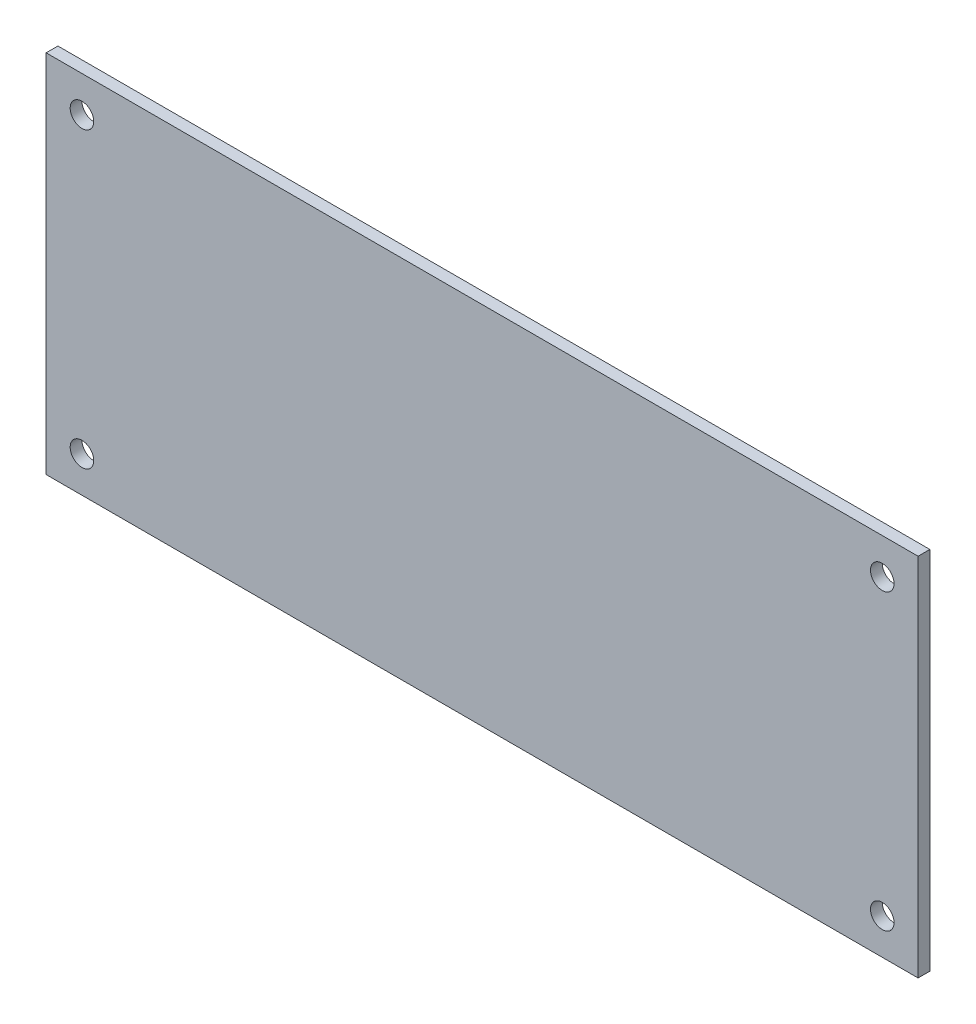
ISO-10303-21;
HEADER;
FILE_DESCRIPTION(('STEP AP214'),'2;1');
FILE_NAME('part.step','',(''),(''),'','','');
FILE_SCHEMA(('AUTOMOTIVE_DESIGN { 1 0 10303 214 1 1 1 1 }'));
ENDSEC;
DATA;
#1=APPLICATION_CONTEXT('core data for automotive mechanical design processes');
#2=APPLICATION_PROTOCOL_DEFINITION('international standard','automotive_design',2000,#1);
#3=PRODUCT_CONTEXT('',#1,'mechanical');
#4=PRODUCT('Part','Part','',(#3));
#5=PRODUCT_RELATED_PRODUCT_CATEGORY('part','',(#4));
#6=PRODUCT_DEFINITION_FORMATION('','',#4);
#7=PRODUCT_DEFINITION_CONTEXT('part definition',#1,'design');
#8=PRODUCT_DEFINITION('design','',#6,#7);
#9=PRODUCT_DEFINITION_SHAPE('','',#8);
#10=(LENGTH_UNIT() NAMED_UNIT(*) SI_UNIT(.MILLI.,.METRE.));
#11=(NAMED_UNIT(*) PLANE_ANGLE_UNIT() SI_UNIT($,.RADIAN.));
#12=(NAMED_UNIT(*) SI_UNIT($,.STERADIAN.) SOLID_ANGLE_UNIT());
#13=UNCERTAINTY_MEASURE_WITH_UNIT(LENGTH_MEASURE(1.E-05),#10,'distance_accuracy_value','');
#14=(GEOMETRIC_REPRESENTATION_CONTEXT(3) GLOBAL_UNCERTAINTY_ASSIGNED_CONTEXT((#13)) GLOBAL_UNIT_ASSIGNED_CONTEXT((#10,
#11,#12)) REPRESENTATION_CONTEXT('',''));
#15=CARTESIAN_POINT('',(0.,0.,0.));
#16=DIRECTION('',(0.,0.,1.));
#17=DIRECTION('',(1.,0.,0.));
#18=AXIS2_PLACEMENT_3D('',#15,#16,#17);
#19=CARTESIAN_POINT('',(117.475,-49.2125,3.175));
#20=DIRECTION('',(-1.,0.,0.));
#21=DIRECTION('',(0.,0.,1.));
#22=AXIS2_PLACEMENT_3D('',#19,#20,#21);
#23=PLANE('',#22);
#24=DIRECTION('',(0.,1.,0.));
#25=VECTOR('',#24,1.);
#26=CARTESIAN_POINT('',(117.475,-49.2125,0.));
#27=LINE('',#26,#25);
#28=CARTESIAN_POINT('',(117.475,-49.2125,0.));
#29=VERTEX_POINT('',#28);
#30=CARTESIAN_POINT('',(117.475,49.2125,0.));
#31=VERTEX_POINT('',#30);
#32=EDGE_CURVE('E96',#29,#31,#27,.T.);
#33=ORIENTED_EDGE('',*,*,#32,.T.);
#34=DIRECTION('',(0.,0.,-1.));
#35=VECTOR('',#34,1.);
#36=CARTESIAN_POINT('',(117.475,49.2125,3.175));
#37=LINE('',#36,#35);
#38=CARTESIAN_POINT('',(117.475,49.2125,3.175));
#39=VERTEX_POINT('',#38);
#40=EDGE_CURVE('E11',#39,#31,#37,.T.);
#41=ORIENTED_EDGE('',*,*,#40,.F.);
#42=DIRECTION('',(0.,1.,0.));
#43=VECTOR('',#42,1.);
#44=CARTESIAN_POINT('',(117.475,-49.2125,3.175));
#45=LINE('',#44,#43);
#46=CARTESIAN_POINT('',(117.475,-49.2125,3.175));
#47=VERTEX_POINT('',#46);
#48=EDGE_CURVE('E84',#47,#39,#45,.T.);
#49=ORIENTED_EDGE('',*,*,#48,.F.);
#50=DIRECTION('',(0.,0.,-1.));
#51=VECTOR('',#50,1.);
#52=CARTESIAN_POINT('',(117.475,-49.2125,3.175));
#53=LINE('',#52,#51);
#54=EDGE_CURVE('E92',#47,#29,#53,.T.);
#55=ORIENTED_EDGE('',*,*,#54,.T.);
#56=EDGE_LOOP('',(#33,#41,#49,#55));
#57=FACE_BOUND('',#56,.T.);
#58=ADVANCED_FACE('F33',(#57),#23,.F.);
#59=CARTESIAN_POINT('',(-117.475,49.2125,3.175));
#60=DIRECTION('',(0.,-1.,0.));
#61=DIRECTION('',(1.,0.,0.));
#62=AXIS2_PLACEMENT_3D('',#59,#60,#61);
#63=PLANE('',#62);
#64=DIRECTION('',(-1.,0.,0.));
#65=VECTOR('',#64,1.);
#66=CARTESIAN_POINT('',(-117.475,49.2125,0.));
#67=LINE('',#66,#65);
#68=CARTESIAN_POINT('',(-117.475,49.2125,0.));
#69=VERTEX_POINT('',#68);
#70=EDGE_CURVE('E88',#31,#69,#67,.T.);
#71=ORIENTED_EDGE('',*,*,#70,.T.);
#72=DIRECTION('',(0.,0.,-1.));
#73=VECTOR('',#72,1.);
#74=CARTESIAN_POINT('',(-117.475,49.2125,3.175));
#75=LINE('',#74,#73);
#76=CARTESIAN_POINT('',(-117.475,49.2125,3.175));
#77=VERTEX_POINT('',#76);
#78=EDGE_CURVE('E41',#77,#69,#75,.T.);
#79=ORIENTED_EDGE('',*,*,#78,.F.);
#80=DIRECTION('',(-1.,0.,0.));
#81=VECTOR('',#80,1.);
#82=CARTESIAN_POINT('',(-117.475,49.2125,3.175));
#83=LINE('',#82,#81);
#84=EDGE_CURVE('E79',#39,#77,#83,.T.);
#85=ORIENTED_EDGE('',*,*,#84,.F.);
#86=ORIENTED_EDGE('',*,*,#40,.T.);
#87=EDGE_LOOP('',(#71,#79,#85,#86));
#88=FACE_BOUND('',#87,.T.);
#89=ADVANCED_FACE('F87',(#88),#63,.F.);
#90=CARTESIAN_POINT('',(-117.475,-49.2125,3.175));
#91=DIRECTION('',(1.,0.,0.));
#92=DIRECTION('',(0.,0.,-1.));
#93=AXIS2_PLACEMENT_3D('',#90,#91,#92);
#94=PLANE('',#93);
#95=DIRECTION('',(0.,-1.,0.));
#96=VECTOR('',#95,1.);
#97=CARTESIAN_POINT('',(-117.475,-49.2125,0.));
#98=LINE('',#97,#96);
#99=CARTESIAN_POINT('',(-117.475,-49.2125,0.));
#100=VERTEX_POINT('',#99);
#101=EDGE_CURVE('E66',#69,#100,#98,.T.);
#102=ORIENTED_EDGE('',*,*,#101,.T.);
#103=DIRECTION('',(0.,0.,-1.));
#104=VECTOR('',#103,1.);
#105=CARTESIAN_POINT('',(-117.475,-49.2125,3.175));
#106=LINE('',#105,#104);
#107=CARTESIAN_POINT('',(-117.475,-49.2125,3.175));
#108=VERTEX_POINT('',#107);
#109=EDGE_CURVE('E89',#108,#100,#106,.T.);
#110=ORIENTED_EDGE('',*,*,#109,.F.);
#111=DIRECTION('',(0.,-1.,0.));
#112=VECTOR('',#111,1.);
#113=CARTESIAN_POINT('',(-117.475,-49.2125,3.175));
#114=LINE('',#113,#112);
#115=EDGE_CURVE('E82',#77,#108,#114,.T.);
#116=ORIENTED_EDGE('',*,*,#115,.F.);
#117=ORIENTED_EDGE('',*,*,#78,.T.);
#118=EDGE_LOOP('',(#102,#110,#116,#117));
#119=FACE_BOUND('',#118,.T.);
#120=ADVANCED_FACE('F90',(#119),#94,.F.);
#121=CARTESIAN_POINT('',(-117.475,-49.2125,3.175));
#122=DIRECTION('',(0.,1.,0.));
#123=DIRECTION('',(-1.,0.,0.));
#124=AXIS2_PLACEMENT_3D('',#121,#122,#123);
#125=PLANE('',#124);
#126=DIRECTION('',(1.,0.,0.));
#127=VECTOR('',#126,1.);
#128=CARTESIAN_POINT('',(-117.475,-49.2125,0.));
#129=LINE('',#128,#127);
#130=EDGE_CURVE('E72',#100,#29,#129,.T.);
#131=ORIENTED_EDGE('',*,*,#130,.T.);
#132=ORIENTED_EDGE('',*,*,#54,.F.);
#133=DIRECTION('',(1.,0.,0.));
#134=VECTOR('',#133,1.);
#135=CARTESIAN_POINT('',(-117.475,-49.2125,3.175));
#136=LINE('',#135,#134);
#137=EDGE_CURVE('E49',#108,#47,#136,.T.);
#138=ORIENTED_EDGE('',*,*,#137,.F.);
#139=ORIENTED_EDGE('',*,*,#109,.T.);
#140=EDGE_LOOP('',(#131,#132,#138,#139));
#141=FACE_BOUND('',#140,.T.);
#142=ADVANCED_FACE('F104',(#141),#125,.F.);
#143=CARTESIAN_POINT('',(0.,0.,3.175));
#144=DIRECTION('',(0.,0.,-1.));
#145=DIRECTION('',(-1.,0.,0.));
#146=AXIS2_PLACEMENT_3D('',#143,#144,#145);
#147=PLANE('',#146);
#148=CARTESIAN_POINT('',(-107.823,-39.5605,3.175));
#149=DIRECTION('',(0.,0.,1.));
#150=DIRECTION('',(1.,0.,0.));
#151=AXIS2_PLACEMENT_3D('',#148,#149,#150);
#152=CIRCLE('',#151,3.175);
#153=CARTESIAN_POINT('',(-104.648,-39.5605,3.175));
#154=VERTEX_POINT('',#153);
#155=EDGE_CURVE('E128',#154,#154,#152,.T.);
#156=ORIENTED_EDGE('',*,*,#155,.F.);
#157=EDGE_LOOP('',(#156));
#158=FACE_BOUND('',#157,.T.);
#159=CARTESIAN_POINT('',(107.823,39.5605,3.175));
#160=DIRECTION('',(0.,0.,1.));
#161=DIRECTION('',(1.,0.,0.));
#162=AXIS2_PLACEMENT_3D('',#159,#160,#161);
#163=CIRCLE('',#162,3.175);
#164=CARTESIAN_POINT('',(110.998,39.5605,3.175));
#165=VERTEX_POINT('',#164);
#166=EDGE_CURVE('E122',#165,#165,#163,.T.);
#167=ORIENTED_EDGE('',*,*,#166,.F.);
#168=EDGE_LOOP('',(#167));
#169=FACE_BOUND('',#168,.T.);
#170=CARTESIAN_POINT('',(107.823,-39.5605,3.175));
#171=DIRECTION('',(0.,0.,1.));
#172=DIRECTION('',(1.,0.,0.));
#173=AXIS2_PLACEMENT_3D('',#170,#171,#172);
#174=CIRCLE('',#173,3.175);
#175=CARTESIAN_POINT('',(110.998,-39.5605,3.175));
#176=VERTEX_POINT('',#175);
#177=EDGE_CURVE('E116',#176,#176,#174,.T.);
#178=ORIENTED_EDGE('',*,*,#177,.F.);
#179=EDGE_LOOP('',(#178));
#180=FACE_BOUND('',#179,.T.);
#181=CARTESIAN_POINT('',(-107.823,39.5605,3.175));
#182=DIRECTION('',(0.,0.,1.));
#183=DIRECTION('',(1.,0.,0.));
#184=AXIS2_PLACEMENT_3D('',#181,#182,#183);
#185=CIRCLE('',#184,3.175);
#186=CARTESIAN_POINT('',(-104.648,39.5605,3.175));
#187=VERTEX_POINT('',#186);
#188=EDGE_CURVE('E110',#187,#187,#185,.T.);
#189=ORIENTED_EDGE('',*,*,#188,.F.);
#190=EDGE_LOOP('',(#189));
#191=FACE_BOUND('',#190,.T.);
#192=ORIENTED_EDGE('',*,*,#48,.T.);
#193=ORIENTED_EDGE('',*,*,#84,.T.);
#194=ORIENTED_EDGE('',*,*,#115,.T.);
#195=ORIENTED_EDGE('',*,*,#137,.T.);
#196=EDGE_LOOP('',(#192,#193,#194,#195));
#197=FACE_BOUND('',#196,.T.);
#198=ADVANCED_FACE('F80',(#158,#169,#180,#191,#197),#147,.F.);
#199=CARTESIAN_POINT('',(0.,0.,0.));
#200=DIRECTION('',(0.,0.,-1.));
#201=DIRECTION('',(-1.,0.,0.));
#202=AXIS2_PLACEMENT_3D('',#199,#200,#201);
#203=PLANE('',#202);
#204=CARTESIAN_POINT('',(-107.823,-39.5605,0.));
#205=DIRECTION('',(0.,0.,1.));
#206=DIRECTION('',(1.,0.,0.));
#207=AXIS2_PLACEMENT_3D('',#204,#205,#206);
#208=CIRCLE('',#207,3.175);
#209=CARTESIAN_POINT('',(-104.648,-39.5605,0.));
#210=VERTEX_POINT('',#209);
#211=EDGE_CURVE('E113',#210,#210,#208,.T.);
#212=ORIENTED_EDGE('',*,*,#211,.T.);
#213=EDGE_LOOP('',(#212));
#214=FACE_BOUND('',#213,.T.);
#215=CARTESIAN_POINT('',(107.823,39.5605,0.));
#216=DIRECTION('',(0.,0.,1.));
#217=DIRECTION('',(1.,0.,0.));
#218=AXIS2_PLACEMENT_3D('',#215,#216,#217);
#219=CIRCLE('',#218,3.175);
#220=CARTESIAN_POINT('',(110.998,39.5605,0.));
#221=VERTEX_POINT('',#220);
#222=EDGE_CURVE('E125',#221,#221,#219,.T.);
#223=ORIENTED_EDGE('',*,*,#222,.T.);
#224=EDGE_LOOP('',(#223));
#225=FACE_BOUND('',#224,.T.);
#226=CARTESIAN_POINT('',(107.823,-39.5605,0.));
#227=DIRECTION('',(0.,0.,1.));
#228=DIRECTION('',(1.,0.,0.));
#229=AXIS2_PLACEMENT_3D('',#226,#227,#228);
#230=CIRCLE('',#229,3.175);
#231=CARTESIAN_POINT('',(110.998,-39.5605,0.));
#232=VERTEX_POINT('',#231);
#233=EDGE_CURVE('E119',#232,#232,#230,.T.);
#234=ORIENTED_EDGE('',*,*,#233,.T.);
#235=EDGE_LOOP('',(#234));
#236=FACE_BOUND('',#235,.T.);
#237=CARTESIAN_POINT('',(-107.823,39.5605,0.));
#238=DIRECTION('',(0.,0.,1.));
#239=DIRECTION('',(1.,0.,0.));
#240=AXIS2_PLACEMENT_3D('',#237,#238,#239);
#241=CIRCLE('',#240,3.175);
#242=CARTESIAN_POINT('',(-104.648,39.5605,0.));
#243=VERTEX_POINT('',#242);
#244=EDGE_CURVE('E99',#243,#243,#241,.T.);
#245=ORIENTED_EDGE('',*,*,#244,.T.);
#246=EDGE_LOOP('',(#245));
#247=FACE_BOUND('',#246,.T.);
#248=ORIENTED_EDGE('',*,*,#32,.F.);
#249=ORIENTED_EDGE('',*,*,#130,.F.);
#250=ORIENTED_EDGE('',*,*,#101,.F.);
#251=ORIENTED_EDGE('',*,*,#70,.F.);
#252=EDGE_LOOP('',(#248,#249,#250,#251));
#253=FACE_BOUND('',#252,.T.);
#254=ADVANCED_FACE('F107',(#214,#225,#236,#247,#253),#203,.T.);
#255=CARTESIAN_POINT('',(-107.823,39.5605,0.));
#256=DIRECTION('',(0.,0.,1.));
#257=DIRECTION('',(1.,0.,0.));
#258=AXIS2_PLACEMENT_3D('',#255,#256,#257);
#259=CYLINDRICAL_SURFACE('',#258,3.175);
#260=ORIENTED_EDGE('',*,*,#244,.F.);
#261=EDGE_LOOP('',(#260));
#262=FACE_BOUND('',#261,.T.);
#263=ORIENTED_EDGE('',*,*,#188,.T.);
#264=EDGE_LOOP('',(#263));
#265=FACE_BOUND('',#264,.T.);
#266=ADVANCED_FACE('F152',(#262,#265),#259,.F.);
#267=CARTESIAN_POINT('',(107.823,-39.5605,0.));
#268=DIRECTION('',(0.,0.,1.));
#269=DIRECTION('',(1.,0.,0.));
#270=AXIS2_PLACEMENT_3D('',#267,#268,#269);
#271=CYLINDRICAL_SURFACE('',#270,3.175);
#272=ORIENTED_EDGE('',*,*,#233,.F.);
#273=EDGE_LOOP('',(#272));
#274=FACE_BOUND('',#273,.T.);
#275=ORIENTED_EDGE('',*,*,#177,.T.);
#276=EDGE_LOOP('',(#275));
#277=FACE_BOUND('',#276,.T.);
#278=ADVANCED_FACE('F154',(#274,#277),#271,.F.);
#279=CARTESIAN_POINT('',(107.823,39.5605,0.));
#280=DIRECTION('',(0.,0.,1.));
#281=DIRECTION('',(1.,0.,0.));
#282=AXIS2_PLACEMENT_3D('',#279,#280,#281);
#283=CYLINDRICAL_SURFACE('',#282,3.175);
#284=ORIENTED_EDGE('',*,*,#222,.F.);
#285=EDGE_LOOP('',(#284));
#286=FACE_BOUND('',#285,.T.);
#287=ORIENTED_EDGE('',*,*,#166,.T.);
#288=EDGE_LOOP('',(#287));
#289=FACE_BOUND('',#288,.T.);
#290=ADVANCED_FACE('F139',(#286,#289),#283,.F.);
#291=CARTESIAN_POINT('',(-107.823,-39.5605,0.));
#292=DIRECTION('',(0.,0.,1.));
#293=DIRECTION('',(1.,0.,0.));
#294=AXIS2_PLACEMENT_3D('',#291,#292,#293);
#295=CYLINDRICAL_SURFACE('',#294,3.175);
#296=ORIENTED_EDGE('',*,*,#211,.F.);
#297=EDGE_LOOP('',(#296));
#298=FACE_BOUND('',#297,.T.);
#299=ORIENTED_EDGE('',*,*,#155,.T.);
#300=EDGE_LOOP('',(#299));
#301=FACE_BOUND('',#300,.T.);
#302=ADVANCED_FACE('F136',(#298,#301),#295,.F.);
#303=CLOSED_SHELL('',(#58,#89,#120,#142,#198,#254,#266,#278,#290,#302));
#304=MANIFOLD_SOLID_BREP('B2',#303);
#305=ADVANCED_BREP_SHAPE_REPRESENTATION('',(#18,#304),#14);
#306=SHAPE_DEFINITION_REPRESENTATION(#9,#305);
ENDSEC;
END-ISO-10303-21;
